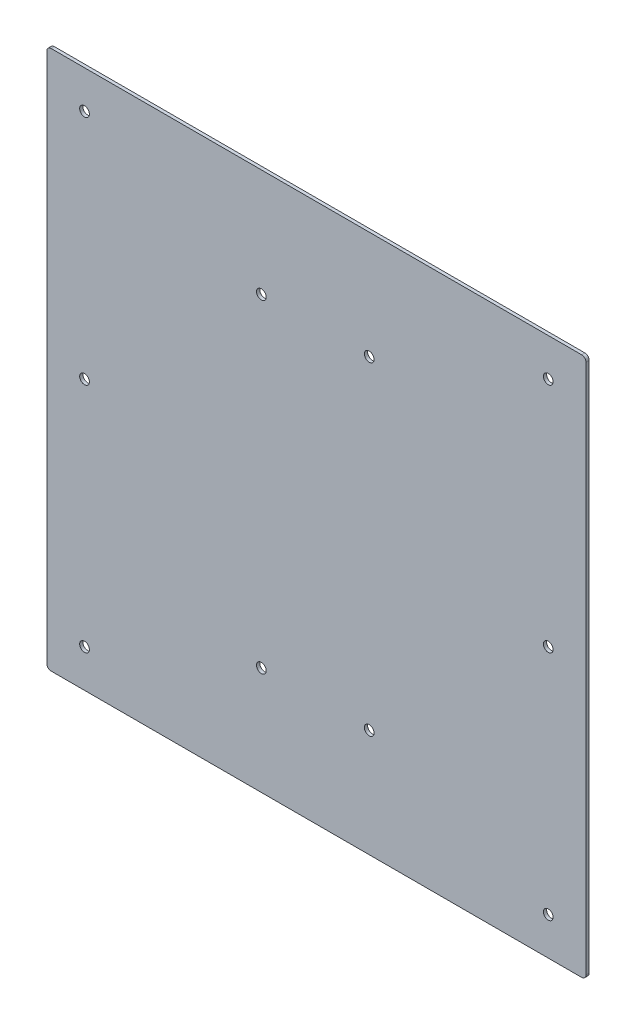
ISO-10303-21;
HEADER;
FILE_DESCRIPTION(('STEP AP214'),'2;1');
FILE_NAME('part.step','',(''),(''),'','','');
FILE_SCHEMA(('AUTOMOTIVE_DESIGN { 1 0 10303 214 1 1 1 1 }'));
ENDSEC;
DATA;
#1=APPLICATION_CONTEXT('core data for automotive mechanical design processes');
#2=APPLICATION_PROTOCOL_DEFINITION('international standard','automotive_design',2000,#1);
#3=PRODUCT_CONTEXT('',#1,'mechanical');
#4=PRODUCT('Part','Part','',(#3));
#5=PRODUCT_RELATED_PRODUCT_CATEGORY('part','',(#4));
#6=PRODUCT_DEFINITION_FORMATION('','',#4);
#7=PRODUCT_DEFINITION_CONTEXT('part definition',#1,'design');
#8=PRODUCT_DEFINITION('design','',#6,#7);
#9=PRODUCT_DEFINITION_SHAPE('','',#8);
#10=(LENGTH_UNIT() NAMED_UNIT(*) SI_UNIT(.MILLI.,.METRE.));
#11=(NAMED_UNIT(*) PLANE_ANGLE_UNIT() SI_UNIT($,.RADIAN.));
#12=(NAMED_UNIT(*) SI_UNIT($,.STERADIAN.) SOLID_ANGLE_UNIT());
#13=UNCERTAINTY_MEASURE_WITH_UNIT(LENGTH_MEASURE(1.E-05),#10,'distance_accuracy_value','');
#14=(GEOMETRIC_REPRESENTATION_CONTEXT(3) GLOBAL_UNCERTAINTY_ASSIGNED_CONTEXT((#13)) GLOBAL_UNIT_ASSIGNED_CONTEXT((#10,
#11,#12)) REPRESENTATION_CONTEXT('',''));
#15=CARTESIAN_POINT('',(0.,0.,0.));
#16=DIRECTION('',(0.,0.,1.));
#17=DIRECTION('',(1.,0.,0.));
#18=AXIS2_PLACEMENT_3D('',#15,#16,#17);
#19=CARTESIAN_POINT('',(0.,0.,1.4986));
#20=DIRECTION('',(0.,0.,-1.));
#21=DIRECTION('',(-1.,0.,0.));
#22=AXIS2_PLACEMENT_3D('',#19,#20,#21);
#23=PLANE('',#22);
#24=CARTESIAN_POINT('',(107.5,0.,1.4986));
#25=DIRECTION('',(0.,0.,1.));
#26=DIRECTION('',(1.,0.,0.));
#27=AXIS2_PLACEMENT_3D('',#24,#25,#26);
#28=CIRCLE('',#27,2.25);
#29=CARTESIAN_POINT('',(109.75,0.,1.4986));
#30=VERTEX_POINT('',#29);
#31=EDGE_CURVE('E218',#30,#30,#28,.T.);
#32=ORIENTED_EDGE('',*,*,#31,.F.);
#33=EDGE_LOOP('',(#32));
#34=FACE_BOUND('',#33,.T.);
#35=CARTESIAN_POINT('',(-107.5,-107.5,1.4986));
#36=DIRECTION('',(0.,0.,1.));
#37=DIRECTION('',(1.,0.,0.));
#38=AXIS2_PLACEMENT_3D('',#35,#36,#37);
#39=CIRCLE('',#38,2.25);
#40=CARTESIAN_POINT('',(-105.25,-107.5,1.4986));
#41=VERTEX_POINT('',#40);
#42=EDGE_CURVE('E213',#41,#41,#39,.T.);
#43=ORIENTED_EDGE('',*,*,#42,.F.);
#44=EDGE_LOOP('',(#43));
#45=FACE_BOUND('',#44,.T.);
#46=CARTESIAN_POINT('',(107.5,-107.5,1.4986));
#47=DIRECTION('',(0.,0.,1.));
#48=DIRECTION('',(1.,0.,0.));
#49=AXIS2_PLACEMENT_3D('',#46,#47,#48);
#50=CIRCLE('',#49,2.25);
#51=CARTESIAN_POINT('',(109.75,-107.5,1.4986));
#52=VERTEX_POINT('',#51);
#53=EDGE_CURVE('E206',#52,#52,#50,.T.);
#54=ORIENTED_EDGE('',*,*,#53,.F.);
#55=EDGE_LOOP('',(#54));
#56=FACE_BOUND('',#55,.T.);
#57=CARTESIAN_POINT('',(107.5,107.5,1.4986));
#58=DIRECTION('',(0.,0.,1.));
#59=DIRECTION('',(1.,0.,0.));
#60=AXIS2_PLACEMENT_3D('',#57,#58,#59);
#61=CIRCLE('',#60,2.25);
#62=CARTESIAN_POINT('',(109.75,107.5,1.4986));
#63=VERTEX_POINT('',#62);
#64=EDGE_CURVE('E205',#63,#63,#61,.T.);
#65=ORIENTED_EDGE('',*,*,#64,.F.);
#66=EDGE_LOOP('',(#65));
#67=FACE_BOUND('',#66,.T.);
#68=CARTESIAN_POINT('',(-107.5,0.,1.4986));
#69=DIRECTION('',(0.,0.,1.));
#70=DIRECTION('',(1.,0.,0.));
#71=AXIS2_PLACEMENT_3D('',#68,#69,#70);
#72=CIRCLE('',#71,2.25);
#73=CARTESIAN_POINT('',(-105.25,0.,1.4986));
#74=VERTEX_POINT('',#73);
#75=EDGE_CURVE('E225',#74,#74,#72,.T.);
#76=ORIENTED_EDGE('',*,*,#75,.F.);
#77=EDGE_LOOP('',(#76));
#78=FACE_BOUND('',#77,.T.);
#79=CARTESIAN_POINT('',(-107.5,107.5,1.4986));
#80=DIRECTION('',(0.,0.,1.));
#81=DIRECTION('',(1.,0.,0.));
#82=AXIS2_PLACEMENT_3D('',#79,#80,#81);
#83=CIRCLE('',#82,2.25);
#84=CARTESIAN_POINT('',(-105.25,107.5,1.4986));
#85=VERTEX_POINT('',#84);
#86=EDGE_CURVE('E202',#85,#85,#83,.T.);
#87=ORIENTED_EDGE('',*,*,#86,.F.);
#88=EDGE_LOOP('',(#87));
#89=FACE_BOUND('',#88,.T.);
#90=DIRECTION('',(0.,-1.,0.));
#91=VECTOR('',#90,1.);
#92=CARTESIAN_POINT('',(-125.,-125.,1.4986));
#93=LINE('',#92,#91);
#94=CARTESIAN_POINT('',(-125.,123.,1.4986));
#95=VERTEX_POINT('',#94);
#96=CARTESIAN_POINT('',(-125.,-123.,1.4986));
#97=VERTEX_POINT('',#96);
#98=EDGE_CURVE('E175',#95,#97,#93,.T.);
#99=ORIENTED_EDGE('',*,*,#98,.T.);
#100=CARTESIAN_POINT('',(-123.,-123.,1.4986));
#101=DIRECTION('',(0.,0.,-1.));
#102=DIRECTION('',(-1.,0.,0.));
#103=AXIS2_PLACEMENT_3D('',#100,#101,#102);
#104=CIRCLE('',#103,2.);
#105=CARTESIAN_POINT('',(-123.,-125.,1.4986));
#106=VERTEX_POINT('',#105);
#107=EDGE_CURVE('E152',#97,#106,#104,.F.);
#108=ORIENTED_EDGE('',*,*,#107,.T.);
#109=DIRECTION('',(1.,0.,0.));
#110=VECTOR('',#109,1.);
#111=CARTESIAN_POINT('',(-125.,-125.,1.4986));
#112=LINE('',#111,#110);
#113=CARTESIAN_POINT('',(123.,-125.,1.4986));
#114=VERTEX_POINT('',#113);
#115=EDGE_CURVE('E123',#106,#114,#112,.T.);
#116=ORIENTED_EDGE('',*,*,#115,.T.);
#117=CARTESIAN_POINT('',(123.,-123.,1.4986));
#118=DIRECTION('',(0.,0.,-1.));
#119=DIRECTION('',(-1.,0.,0.));
#120=AXIS2_PLACEMENT_3D('',#117,#118,#119);
#121=CIRCLE('',#120,2.);
#122=CARTESIAN_POINT('',(125.,-123.,1.4986));
#123=VERTEX_POINT('',#122);
#124=EDGE_CURVE('E150',#114,#123,#121,.F.);
#125=ORIENTED_EDGE('',*,*,#124,.T.);
#126=DIRECTION('',(0.,1.,0.));
#127=VECTOR('',#126,1.);
#128=CARTESIAN_POINT('',(125.,-125.,1.4986));
#129=LINE('',#128,#127);
#130=CARTESIAN_POINT('',(125.,123.,1.4986));
#131=VERTEX_POINT('',#130);
#132=EDGE_CURVE('E130',#123,#131,#129,.T.);
#133=ORIENTED_EDGE('',*,*,#132,.T.);
#134=CARTESIAN_POINT('',(123.,123.,1.4986));
#135=DIRECTION('',(0.,0.,-1.));
#136=DIRECTION('',(-1.,0.,0.));
#137=AXIS2_PLACEMENT_3D('',#134,#135,#136);
#138=CIRCLE('',#137,2.);
#139=CARTESIAN_POINT('',(123.,125.,1.4986));
#140=VERTEX_POINT('',#139);
#141=EDGE_CURVE('E58',#131,#140,#138,.F.);
#142=ORIENTED_EDGE('',*,*,#141,.T.);
#143=DIRECTION('',(-1.,0.,0.));
#144=VECTOR('',#143,1.);
#145=CARTESIAN_POINT('',(-125.,125.,1.4986));
#146=LINE('',#145,#144);
#147=CARTESIAN_POINT('',(-123.,125.,1.4986));
#148=VERTEX_POINT('',#147);
#149=EDGE_CURVE('E133',#140,#148,#146,.T.);
#150=ORIENTED_EDGE('',*,*,#149,.T.);
#151=CARTESIAN_POINT('',(-123.,123.,1.4986));
#152=DIRECTION('',(0.,0.,-1.));
#153=DIRECTION('',(-1.,0.,0.));
#154=AXIS2_PLACEMENT_3D('',#151,#152,#153);
#155=CIRCLE('',#154,2.);
#156=EDGE_CURVE('E147',#148,#95,#155,.F.);
#157=ORIENTED_EDGE('',*,*,#156,.T.);
#158=EDGE_LOOP('',(#99,#108,#116,#125,#133,#142,#150,#157));
#159=FACE_BOUND('',#158,.T.);
#160=CARTESIAN_POINT('',(-25.5,75.,1.4986));
#161=DIRECTION('',(0.,0.,1.));
#162=DIRECTION('',(1.,0.,0.));
#163=AXIS2_PLACEMENT_3D('',#160,#161,#162);
#164=CIRCLE('',#163,2.25);
#165=CARTESIAN_POINT('',(-27.75,75.,1.4986));
#166=VERTEX_POINT('',#165);
#167=EDGE_CURVE('E168',#166,#166,#164,.T.);
#168=ORIENTED_EDGE('',*,*,#167,.F.);
#169=EDGE_LOOP('',(#168));
#170=FACE_BOUND('',#169,.T.);
#171=CARTESIAN_POINT('',(24.5,75.,1.4986));
#172=DIRECTION('',(0.,0.,1.));
#173=DIRECTION('',(1.,0.,0.));
#174=AXIS2_PLACEMENT_3D('',#171,#172,#173);
#175=CIRCLE('',#174,2.25);
#176=CARTESIAN_POINT('',(22.25,75.,1.4986));
#177=VERTEX_POINT('',#176);
#178=EDGE_CURVE('E180',#177,#177,#175,.T.);
#179=ORIENTED_EDGE('',*,*,#178,.F.);
#180=EDGE_LOOP('',(#179));
#181=FACE_BOUND('',#180,.T.);
#182=CARTESIAN_POINT('',(24.5,-75.,1.4986));
#183=DIRECTION('',(0.,0.,1.));
#184=DIRECTION('',(1.,0.,0.));
#185=AXIS2_PLACEMENT_3D('',#182,#183,#184);
#186=CIRCLE('',#185,2.25);
#187=CARTESIAN_POINT('',(22.25,-75.,1.4986));
#188=VERTEX_POINT('',#187);
#189=EDGE_CURVE('E185',#188,#188,#186,.T.);
#190=ORIENTED_EDGE('',*,*,#189,.F.);
#191=EDGE_LOOP('',(#190));
#192=FACE_BOUND('',#191,.T.);
#193=CARTESIAN_POINT('',(-25.5,-75.,1.4986));
#194=DIRECTION('',(0.,0.,1.));
#195=DIRECTION('',(1.,0.,0.));
#196=AXIS2_PLACEMENT_3D('',#193,#194,#195);
#197=CIRCLE('',#196,2.25);
#198=CARTESIAN_POINT('',(-27.75,-75.,1.4986));
#199=VERTEX_POINT('',#198);
#200=EDGE_CURVE('E191',#199,#199,#197,.T.);
#201=ORIENTED_EDGE('',*,*,#200,.F.);
#202=EDGE_LOOP('',(#201));
#203=FACE_BOUND('',#202,.T.);
#204=ADVANCED_FACE('F37',(#34,#45,#56,#67,#78,#89,#159,#170,#181,#192,#203),#23,.F.);
#205=CARTESIAN_POINT('',(0.,0.,0.));
#206=DIRECTION('',(0.,0.,-1.));
#207=DIRECTION('',(-1.,0.,0.));
#208=AXIS2_PLACEMENT_3D('',#205,#206,#207);
#209=PLANE('',#208);
#210=CARTESIAN_POINT('',(107.5,0.,0.));
#211=DIRECTION('',(0.,0.,-1.));
#212=DIRECTION('',(-1.,0.,0.));
#213=AXIS2_PLACEMENT_3D('',#210,#211,#212);
#214=CIRCLE('',#213,2.25);
#215=CARTESIAN_POINT('',(105.25,0.,0.));
#216=VERTEX_POINT('',#215);
#217=EDGE_CURVE('E222',#216,#216,#214,.F.);
#218=ORIENTED_EDGE('',*,*,#217,.T.);
#219=EDGE_LOOP('',(#218));
#220=FACE_BOUND('',#219,.T.);
#221=CARTESIAN_POINT('',(-107.5,-107.5,0.));
#222=DIRECTION('',(0.,0.,-1.));
#223=DIRECTION('',(-1.,0.,0.));
#224=AXIS2_PLACEMENT_3D('',#221,#222,#223);
#225=CIRCLE('',#224,2.25);
#226=CARTESIAN_POINT('',(-109.75,-107.5,0.));
#227=VERTEX_POINT('',#226);
#228=EDGE_CURVE('E221',#227,#227,#225,.F.);
#229=ORIENTED_EDGE('',*,*,#228,.T.);
#230=EDGE_LOOP('',(#229));
#231=FACE_BOUND('',#230,.T.);
#232=CARTESIAN_POINT('',(107.5,-107.5,0.));
#233=DIRECTION('',(0.,0.,-1.));
#234=DIRECTION('',(-1.,0.,0.));
#235=AXIS2_PLACEMENT_3D('',#232,#233,#234);
#236=CIRCLE('',#235,2.25);
#237=CARTESIAN_POINT('',(105.25,-107.5,0.));
#238=VERTEX_POINT('',#237);
#239=EDGE_CURVE('E210',#238,#238,#236,.F.);
#240=ORIENTED_EDGE('',*,*,#239,.T.);
#241=EDGE_LOOP('',(#240));
#242=FACE_BOUND('',#241,.T.);
#243=CARTESIAN_POINT('',(107.5,107.5,0.));
#244=DIRECTION('',(0.,0.,-1.));
#245=DIRECTION('',(-1.,0.,0.));
#246=AXIS2_PLACEMENT_3D('',#243,#244,#245);
#247=CIRCLE('',#246,2.25);
#248=CARTESIAN_POINT('',(105.25,107.5,0.));
#249=VERTEX_POINT('',#248);
#250=EDGE_CURVE('E209',#249,#249,#247,.F.);
#251=ORIENTED_EDGE('',*,*,#250,.T.);
#252=EDGE_LOOP('',(#251));
#253=FACE_BOUND('',#252,.T.);
#254=CARTESIAN_POINT('',(-107.5,0.,0.));
#255=DIRECTION('',(0.,0.,-1.));
#256=DIRECTION('',(-1.,0.,0.));
#257=AXIS2_PLACEMENT_3D('',#254,#255,#256);
#258=CIRCLE('',#257,2.25);
#259=CARTESIAN_POINT('',(-109.75,0.,0.));
#260=VERTEX_POINT('',#259);
#261=EDGE_CURVE('E232',#260,#260,#258,.F.);
#262=ORIENTED_EDGE('',*,*,#261,.T.);
#263=EDGE_LOOP('',(#262));
#264=FACE_BOUND('',#263,.T.);
#265=CARTESIAN_POINT('',(-107.5,107.5,0.));
#266=DIRECTION('',(0.,0.,-1.));
#267=DIRECTION('',(-1.,0.,0.));
#268=AXIS2_PLACEMENT_3D('',#265,#266,#267);
#269=CIRCLE('',#268,2.25);
#270=CARTESIAN_POINT('',(-109.75,107.5,0.));
#271=VERTEX_POINT('',#270);
#272=EDGE_CURVE('E197',#271,#271,#269,.F.);
#273=ORIENTED_EDGE('',*,*,#272,.T.);
#274=EDGE_LOOP('',(#273));
#275=FACE_BOUND('',#274,.T.);
#276=CARTESIAN_POINT('',(24.5,-75.,0.));
#277=DIRECTION('',(0.,0.,1.));
#278=DIRECTION('',(1.,0.,0.));
#279=AXIS2_PLACEMENT_3D('',#276,#277,#278);
#280=CIRCLE('',#279,2.25);
#281=CARTESIAN_POINT('',(22.25,-75.,0.));
#282=VERTEX_POINT('',#281);
#283=EDGE_CURVE('E188',#282,#282,#280,.T.);
#284=ORIENTED_EDGE('',*,*,#283,.T.);
#285=EDGE_LOOP('',(#284));
#286=FACE_BOUND('',#285,.T.);
#287=CARTESIAN_POINT('',(-25.5,75.,0.));
#288=DIRECTION('',(0.,0.,1.));
#289=DIRECTION('',(1.,0.,0.));
#290=AXIS2_PLACEMENT_3D('',#287,#288,#289);
#291=CIRCLE('',#290,2.25);
#292=CARTESIAN_POINT('',(-27.75,75.,0.));
#293=VERTEX_POINT('',#292);
#294=EDGE_CURVE('E171',#293,#293,#291,.T.);
#295=ORIENTED_EDGE('',*,*,#294,.T.);
#296=EDGE_LOOP('',(#295));
#297=FACE_BOUND('',#296,.T.);
#298=DIRECTION('',(1.,0.,0.));
#299=VECTOR('',#298,1.);
#300=CARTESIAN_POINT('',(-125.,-125.,0.));
#301=LINE('',#300,#299);
#302=CARTESIAN_POINT('',(-123.,-125.,0.));
#303=VERTEX_POINT('',#302);
#304=CARTESIAN_POINT('',(123.,-125.,0.));
#305=VERTEX_POINT('',#304);
#306=EDGE_CURVE('E120',#303,#305,#301,.T.);
#307=ORIENTED_EDGE('',*,*,#306,.F.);
#308=CARTESIAN_POINT('',(-123.,-123.,0.));
#309=DIRECTION('',(0.,0.,-1.));
#310=DIRECTION('',(-1.,0.,0.));
#311=AXIS2_PLACEMENT_3D('',#308,#309,#310);
#312=CIRCLE('',#311,2.);
#313=CARTESIAN_POINT('',(-125.,-123.,0.));
#314=VERTEX_POINT('',#313);
#315=EDGE_CURVE('E103',#303,#314,#312,.T.);
#316=ORIENTED_EDGE('',*,*,#315,.T.);
#317=DIRECTION('',(0.,-1.,0.));
#318=VECTOR('',#317,1.);
#319=CARTESIAN_POINT('',(-125.,-125.,0.));
#320=LINE('',#319,#318);
#321=CARTESIAN_POINT('',(-125.,123.,0.));
#322=VERTEX_POINT('',#321);
#323=EDGE_CURVE('E131',#322,#314,#320,.T.);
#324=ORIENTED_EDGE('',*,*,#323,.F.);
#325=CARTESIAN_POINT('',(-123.,123.,0.));
#326=DIRECTION('',(0.,0.,-1.));
#327=DIRECTION('',(-1.,0.,0.));
#328=AXIS2_PLACEMENT_3D('',#325,#326,#327);
#329=CIRCLE('',#328,2.);
#330=CARTESIAN_POINT('',(-123.,125.,0.));
#331=VERTEX_POINT('',#330);
#332=EDGE_CURVE('E124',#322,#331,#329,.T.);
#333=ORIENTED_EDGE('',*,*,#332,.T.);
#334=DIRECTION('',(-1.,0.,0.));
#335=VECTOR('',#334,1.);
#336=CARTESIAN_POINT('',(-125.,125.,0.));
#337=LINE('',#336,#335);
#338=CARTESIAN_POINT('',(123.,125.,0.));
#339=VERTEX_POINT('',#338);
#340=EDGE_CURVE('E135',#339,#331,#337,.T.);
#341=ORIENTED_EDGE('',*,*,#340,.F.);
#342=CARTESIAN_POINT('',(123.,123.,0.));
#343=DIRECTION('',(0.,0.,-1.));
#344=DIRECTION('',(-1.,0.,0.));
#345=AXIS2_PLACEMENT_3D('',#342,#343,#344);
#346=CIRCLE('',#345,2.);
#347=CARTESIAN_POINT('',(125.,123.,0.));
#348=VERTEX_POINT('',#347);
#349=EDGE_CURVE('E141',#339,#348,#346,.T.);
#350=ORIENTED_EDGE('',*,*,#349,.T.);
#351=DIRECTION('',(0.,1.,0.));
#352=VECTOR('',#351,1.);
#353=CARTESIAN_POINT('',(125.,-125.,0.));
#354=LINE('',#353,#352);
#355=CARTESIAN_POINT('',(125.,-123.,0.));
#356=VERTEX_POINT('',#355);
#357=EDGE_CURVE('E163',#356,#348,#354,.T.);
#358=ORIENTED_EDGE('',*,*,#357,.F.);
#359=CARTESIAN_POINT('',(123.,-123.,0.));
#360=DIRECTION('',(0.,0.,-1.));
#361=DIRECTION('',(-1.,0.,0.));
#362=AXIS2_PLACEMENT_3D('',#359,#360,#361);
#363=CIRCLE('',#362,2.);
#364=EDGE_CURVE('E114',#356,#305,#363,.T.);
#365=ORIENTED_EDGE('',*,*,#364,.T.);
#366=EDGE_LOOP('',(#307,#316,#324,#333,#341,#350,#358,#365));
#367=FACE_BOUND('',#366,.T.);
#368=CARTESIAN_POINT('',(24.5,75.,0.));
#369=DIRECTION('',(0.,0.,1.));
#370=DIRECTION('',(1.,0.,0.));
#371=AXIS2_PLACEMENT_3D('',#368,#369,#370);
#372=CIRCLE('',#371,2.25);
#373=CARTESIAN_POINT('',(22.25,75.,0.));
#374=VERTEX_POINT('',#373);
#375=EDGE_CURVE('E182',#374,#374,#372,.T.);
#376=ORIENTED_EDGE('',*,*,#375,.T.);
#377=EDGE_LOOP('',(#376));
#378=FACE_BOUND('',#377,.T.);
#379=CARTESIAN_POINT('',(-25.5,-75.,0.));
#380=DIRECTION('',(0.,0.,1.));
#381=DIRECTION('',(1.,0.,0.));
#382=AXIS2_PLACEMENT_3D('',#379,#380,#381);
#383=CIRCLE('',#382,2.25);
#384=CARTESIAN_POINT('',(-27.75,-75.,0.));
#385=VERTEX_POINT('',#384);
#386=EDGE_CURVE('E194',#385,#385,#383,.T.);
#387=ORIENTED_EDGE('',*,*,#386,.T.);
#388=EDGE_LOOP('',(#387));
#389=FACE_BOUND('',#388,.T.);
#390=ADVANCED_FACE('F127',(#220,#231,#242,#253,#264,#275,#286,#297,#367,#378,#389),#209,.T.);
#391=CARTESIAN_POINT('',(125.,-125.,1.4986));
#392=DIRECTION('',(-1.,0.,0.));
#393=DIRECTION('',(0.,0.,1.));
#394=AXIS2_PLACEMENT_3D('',#391,#392,#393);
#395=PLANE('',#394);
#396=ORIENTED_EDGE('',*,*,#132,.F.);
#397=DIRECTION('',(0.,0.,-1.));
#398=VECTOR('',#397,1.);
#399=CARTESIAN_POINT('',(125.,-123.,1.4986));
#400=LINE('',#399,#398);
#401=EDGE_CURVE('E156',#123,#356,#400,.T.);
#402=ORIENTED_EDGE('',*,*,#401,.T.);
#403=ORIENTED_EDGE('',*,*,#357,.T.);
#404=DIRECTION('',(0.,0.,-1.));
#405=VECTOR('',#404,1.);
#406=CARTESIAN_POINT('',(125.,123.,1.4986));
#407=LINE('',#406,#405);
#408=EDGE_CURVE('E154',#348,#131,#407,.F.);
#409=ORIENTED_EDGE('',*,*,#408,.T.);
#410=EDGE_LOOP('',(#396,#402,#403,#409));
#411=FACE_BOUND('',#410,.T.);
#412=ADVANCED_FACE('F162',(#411),#395,.F.);
#413=CARTESIAN_POINT('',(-125.,125.,1.4986));
#414=DIRECTION('',(0.,-1.,0.));
#415=DIRECTION('',(0.,0.,-1.));
#416=AXIS2_PLACEMENT_3D('',#413,#414,#415);
#417=PLANE('',#416);
#418=ORIENTED_EDGE('',*,*,#149,.F.);
#419=DIRECTION('',(0.,0.,-1.));
#420=VECTOR('',#419,1.);
#421=CARTESIAN_POINT('',(123.,125.,1.4986));
#422=LINE('',#421,#420);
#423=EDGE_CURVE('E11',#140,#339,#422,.T.);
#424=ORIENTED_EDGE('',*,*,#423,.T.);
#425=ORIENTED_EDGE('',*,*,#340,.T.);
#426=DIRECTION('',(0.,0.,-1.));
#427=VECTOR('',#426,1.);
#428=CARTESIAN_POINT('',(-123.,125.,1.4986));
#429=LINE('',#428,#427);
#430=EDGE_CURVE('E45',#331,#148,#429,.F.);
#431=ORIENTED_EDGE('',*,*,#430,.T.);
#432=EDGE_LOOP('',(#418,#424,#425,#431));
#433=FACE_BOUND('',#432,.T.);
#434=ADVANCED_FACE('F273',(#433),#417,.F.);
#435=CARTESIAN_POINT('',(-125.,-125.,1.4986));
#436=DIRECTION('',(1.,0.,0.));
#437=DIRECTION('',(0.,0.,-1.));
#438=AXIS2_PLACEMENT_3D('',#435,#436,#437);
#439=PLANE('',#438);
#440=ORIENTED_EDGE('',*,*,#323,.T.);
#441=DIRECTION('',(0.,0.,-1.));
#442=VECTOR('',#441,1.);
#443=CARTESIAN_POINT('',(-125.,-123.,1.4986));
#444=LINE('',#443,#442);
#445=EDGE_CURVE('E108',#314,#97,#444,.F.);
#446=ORIENTED_EDGE('',*,*,#445,.T.);
#447=ORIENTED_EDGE('',*,*,#98,.F.);
#448=DIRECTION('',(0.,0.,-1.));
#449=VECTOR('',#448,1.);
#450=CARTESIAN_POINT('',(-125.,123.,1.4986));
#451=LINE('',#450,#449);
#452=EDGE_CURVE('E113',#95,#322,#451,.T.);
#453=ORIENTED_EDGE('',*,*,#452,.T.);
#454=EDGE_LOOP('',(#440,#446,#447,#453));
#455=FACE_BOUND('',#454,.T.);
#456=ADVANCED_FACE('F270',(#455),#439,.F.);
#457=CARTESIAN_POINT('',(-125.,-125.,1.4986));
#458=DIRECTION('',(0.,1.,0.));
#459=DIRECTION('',(0.,0.,1.));
#460=AXIS2_PLACEMENT_3D('',#457,#458,#459);
#461=PLANE('',#460);
#462=ORIENTED_EDGE('',*,*,#115,.F.);
#463=DIRECTION('',(0.,0.,-1.));
#464=VECTOR('',#463,1.);
#465=CARTESIAN_POINT('',(-123.,-125.,1.4986));
#466=LINE('',#465,#464);
#467=EDGE_CURVE('E107',#106,#303,#466,.T.);
#468=ORIENTED_EDGE('',*,*,#467,.T.);
#469=ORIENTED_EDGE('',*,*,#306,.T.);
#470=DIRECTION('',(0.,0.,-1.));
#471=VECTOR('',#470,1.);
#472=CARTESIAN_POINT('',(123.,-125.,1.4986));
#473=LINE('',#472,#471);
#474=EDGE_CURVE('E125',#305,#114,#473,.F.);
#475=ORIENTED_EDGE('',*,*,#474,.T.);
#476=EDGE_LOOP('',(#462,#468,#469,#475));
#477=FACE_BOUND('',#476,.T.);
#478=ADVANCED_FACE('F119',(#477),#461,.F.);
#479=CARTESIAN_POINT('',(-25.5,75.,1.4986));
#480=DIRECTION('',(0.,0.,-1.));
#481=DIRECTION('',(-1.,0.,0.));
#482=AXIS2_PLACEMENT_3D('',#479,#480,#481);
#483=CYLINDRICAL_SURFACE('',#482,2.25);
#484=CARTESIAN_POINT('',(-27.75,75.,1.4986));
#485=CARTESIAN_POINT('',(-27.75,75.,1.48298958333333));
#486=CARTESIAN_POINT('',(-27.75,75.,1.46737916666667));
#487=CARTESIAN_POINT('',(-27.75,75.,1.43615833333333));
#488=CARTESIAN_POINT('',(-27.75,75.,1.42054791666667));
#489=CARTESIAN_POINT('',(-27.75,75.,1.38932708333333));
#490=CARTESIAN_POINT('',(-27.75,75.,1.37371666666667));
#491=CARTESIAN_POINT('',(-27.75,75.,1.34249583333333));
#492=CARTESIAN_POINT('',(-27.75,75.,1.32688541666667));
#493=CARTESIAN_POINT('',(-27.75,75.,1.29566458333333));
#494=CARTESIAN_POINT('',(-27.75,75.,1.28005416666667));
#495=CARTESIAN_POINT('',(-27.75,75.,1.24883333333333));
#496=CARTESIAN_POINT('',(-27.75,75.,1.23322291666667));
#497=CARTESIAN_POINT('',(-27.75,75.,1.20200208333333));
#498=CARTESIAN_POINT('',(-27.75,75.,1.18639166666667));
#499=CARTESIAN_POINT('',(-27.75,75.,1.15517083333333));
#500=CARTESIAN_POINT('',(-27.75,75.,1.13956041666667));
#501=CARTESIAN_POINT('',(-27.75,75.,1.10833958333333));
#502=CARTESIAN_POINT('',(-27.75,75.,1.09272916666667));
#503=CARTESIAN_POINT('',(-27.75,75.,1.06150833333333));
#504=CARTESIAN_POINT('',(-27.75,75.,1.04589791666667));
#505=CARTESIAN_POINT('',(-27.75,75.,1.01467708333333));
#506=CARTESIAN_POINT('',(-27.75,75.,0.999066666666667));
#507=CARTESIAN_POINT('',(-27.75,75.,0.967845833333333));
#508=CARTESIAN_POINT('',(-27.75,75.,0.952235416666667));
#509=CARTESIAN_POINT('',(-27.75,75.,0.921014583333333));
#510=CARTESIAN_POINT('',(-27.75,75.,0.905404166666667));
#511=CARTESIAN_POINT('',(-27.75,75.,0.874183333333333));
#512=CARTESIAN_POINT('',(-27.75,75.,0.858572916666667));
#513=CARTESIAN_POINT('',(-27.75,75.,0.827352083333333));
#514=CARTESIAN_POINT('',(-27.75,75.,0.811741666666667));
#515=CARTESIAN_POINT('',(-27.75,75.,0.780520833333333));
#516=CARTESIAN_POINT('',(-27.75,75.,0.764910416666667));
#517=CARTESIAN_POINT('',(-27.75,75.,0.733689583333333));
#518=CARTESIAN_POINT('',(-27.75,75.,0.718079166666667));
#519=CARTESIAN_POINT('',(-27.75,75.,0.686858333333333));
#520=CARTESIAN_POINT('',(-27.75,75.,0.671247916666667));
#521=CARTESIAN_POINT('',(-27.75,75.,0.640027083333333));
#522=CARTESIAN_POINT('',(-27.75,75.,0.624416666666667));
#523=CARTESIAN_POINT('',(-27.75,75.,0.593195833333333));
#524=CARTESIAN_POINT('',(-27.75,75.,0.577585416666667));
#525=CARTESIAN_POINT('',(-27.75,75.,0.546364583333333));
#526=CARTESIAN_POINT('',(-27.75,75.,0.530754166666667));
#527=CARTESIAN_POINT('',(-27.75,75.,0.499533333333333));
#528=CARTESIAN_POINT('',(-27.75,75.,0.483922916666667));
#529=CARTESIAN_POINT('',(-27.75,75.,0.452702083333333));
#530=CARTESIAN_POINT('',(-27.75,75.,0.437091666666667));
#531=CARTESIAN_POINT('',(-27.75,75.,0.405870833333333));
#532=CARTESIAN_POINT('',(-27.75,75.,0.390260416666667));
#533=CARTESIAN_POINT('',(-27.75,75.,0.359039583333333));
#534=CARTESIAN_POINT('',(-27.75,75.,0.343429166666667));
#535=CARTESIAN_POINT('',(-27.75,75.,0.312208333333333));
#536=CARTESIAN_POINT('',(-27.75,75.,0.296597916666667));
#537=CARTESIAN_POINT('',(-27.75,75.,0.265377083333333));
#538=CARTESIAN_POINT('',(-27.75,75.,0.249766666666667));
#539=CARTESIAN_POINT('',(-27.75,75.,0.218545833333333));
#540=CARTESIAN_POINT('',(-27.75,75.,0.202935416666667));
#541=CARTESIAN_POINT('',(-27.75,75.,0.171714583333333));
#542=CARTESIAN_POINT('',(-27.75,75.,0.156104166666667));
#543=CARTESIAN_POINT('',(-27.75,75.,0.124883333333333));
#544=CARTESIAN_POINT('',(-27.75,75.,0.109272916666667));
#545=CARTESIAN_POINT('',(-27.75,75.,0.0780520833333333));
#546=CARTESIAN_POINT('',(-27.75,75.,0.0624416666666667));
#547=CARTESIAN_POINT('',(-27.75,75.,0.0312208333333334));
#548=CARTESIAN_POINT('',(-27.75,75.,0.0156104166666667));
#549=CARTESIAN_POINT('',(-27.75,75.,0.));
#550=B_SPLINE_CURVE_WITH_KNOTS('',3,(#484,#485,#486,#487,#488,#489,#490,#491,#492,#493,#494,
#495,#496,#497,#498,#499,#500,#501,#502,#503,#504,#505,#506,#507,#508,#509,#510,#511,#512,#513,
#514,#515,#516,#517,#518,#519,#520,#521,#522,#523,#524,#525,#526,#527,#528,#529,#530,#531,#532,
#533,#534,#535,#536,#537,#538,#539,#540,#541,#542,#543,#544,#545,#546,#547,#548,#549),
.UNSPECIFIED.,.F.,.F.,(4,2,2,2,2,2,2,2,2,2,2,2,2,2,2,2,2,2,2,2,2,2,2,2,2,2,2,2,2,2,2,2,4),(0.,
0.0468312499999999,0.0936625,0.14049375,0.187325,0.23415625,0.2809875,0.32781875,0.37465,
0.42148125,0.4683125,0.51514375,0.561975,0.60880625,0.6556375,0.70246875,0.7493,0.79613125,
0.8429625,0.88979375,0.936625,0.98345625,1.0302875,1.07711875,1.12395,1.17078125,1.2176125,
1.26444375,1.311275,1.35810625,1.4049375,1.45176875,1.4986),.UNSPECIFIED.);
#551=EDGE_CURVE('BSEAM265',#166,#293,#550,.T.);
#552=ORIENTED_EDGE('',*,*,#167,.T.);
#553=ORIENTED_EDGE('',*,*,#294,.F.);
#554=ORIENTED_EDGE('',*,*,#551,.T.);
#555=ORIENTED_EDGE('',*,*,#551,.F.);
#556=EDGE_LOOP('',(#552,#554,#553,#555));
#557=FACE_BOUND('',#556,.T.);
#558=ADVANCED_FACE('F265',(#557),#483,.F.);
#559=CARTESIAN_POINT('',(24.5,75.,1.4986));
#560=DIRECTION('',(0.,0.,-1.));
#561=DIRECTION('',(-1.,0.,0.));
#562=AXIS2_PLACEMENT_3D('',#559,#560,#561);
#563=CYLINDRICAL_SURFACE('',#562,2.25);
#564=CARTESIAN_POINT('',(22.25,75.,1.4986));
#565=CARTESIAN_POINT('',(22.25,75.,1.48298958333333));
#566=CARTESIAN_POINT('',(22.25,75.,1.46737916666667));
#567=CARTESIAN_POINT('',(22.25,75.,1.43615833333333));
#568=CARTESIAN_POINT('',(22.25,75.,1.42054791666667));
#569=CARTESIAN_POINT('',(22.25,75.,1.38932708333333));
#570=CARTESIAN_POINT('',(22.25,75.,1.37371666666667));
#571=CARTESIAN_POINT('',(22.25,75.,1.34249583333333));
#572=CARTESIAN_POINT('',(22.25,75.,1.32688541666667));
#573=CARTESIAN_POINT('',(22.25,75.,1.29566458333333));
#574=CARTESIAN_POINT('',(22.25,75.,1.28005416666667));
#575=CARTESIAN_POINT('',(22.25,75.,1.24883333333333));
#576=CARTESIAN_POINT('',(22.25,75.,1.23322291666667));
#577=CARTESIAN_POINT('',(22.25,75.,1.20200208333333));
#578=CARTESIAN_POINT('',(22.25,75.,1.18639166666667));
#579=CARTESIAN_POINT('',(22.25,75.,1.15517083333333));
#580=CARTESIAN_POINT('',(22.25,75.,1.13956041666667));
#581=CARTESIAN_POINT('',(22.25,75.,1.10833958333333));
#582=CARTESIAN_POINT('',(22.25,75.,1.09272916666667));
#583=CARTESIAN_POINT('',(22.25,75.,1.06150833333333));
#584=CARTESIAN_POINT('',(22.25,75.,1.04589791666667));
#585=CARTESIAN_POINT('',(22.25,75.,1.01467708333333));
#586=CARTESIAN_POINT('',(22.25,75.,0.999066666666667));
#587=CARTESIAN_POINT('',(22.25,75.,0.967845833333333));
#588=CARTESIAN_POINT('',(22.25,75.,0.952235416666667));
#589=CARTESIAN_POINT('',(22.25,75.,0.921014583333333));
#590=CARTESIAN_POINT('',(22.25,75.,0.905404166666667));
#591=CARTESIAN_POINT('',(22.25,75.,0.874183333333333));
#592=CARTESIAN_POINT('',(22.25,75.,0.858572916666667));
#593=CARTESIAN_POINT('',(22.25,75.,0.827352083333333));
#594=CARTESIAN_POINT('',(22.25,75.,0.811741666666667));
#595=CARTESIAN_POINT('',(22.25,75.,0.780520833333333));
#596=CARTESIAN_POINT('',(22.25,75.,0.764910416666667));
#597=CARTESIAN_POINT('',(22.25,75.,0.733689583333333));
#598=CARTESIAN_POINT('',(22.25,75.,0.718079166666667));
#599=CARTESIAN_POINT('',(22.25,75.,0.686858333333333));
#600=CARTESIAN_POINT('',(22.25,75.,0.671247916666667));
#601=CARTESIAN_POINT('',(22.25,75.,0.640027083333333));
#602=CARTESIAN_POINT('',(22.25,75.,0.624416666666667));
#603=CARTESIAN_POINT('',(22.25,75.,0.593195833333333));
#604=CARTESIAN_POINT('',(22.25,75.,0.577585416666667));
#605=CARTESIAN_POINT('',(22.25,75.,0.546364583333333));
#606=CARTESIAN_POINT('',(22.25,75.,0.530754166666667));
#607=CARTESIAN_POINT('',(22.25,75.,0.499533333333333));
#608=CARTESIAN_POINT('',(22.25,75.,0.483922916666667));
#609=CARTESIAN_POINT('',(22.25,75.,0.452702083333333));
#610=CARTESIAN_POINT('',(22.25,75.,0.437091666666667));
#611=CARTESIAN_POINT('',(22.25,75.,0.405870833333333));
#612=CARTESIAN_POINT('',(22.25,75.,0.390260416666667));
#613=CARTESIAN_POINT('',(22.25,75.,0.359039583333333));
#614=CARTESIAN_POINT('',(22.25,75.,0.343429166666667));
#615=CARTESIAN_POINT('',(22.25,75.,0.312208333333333));
#616=CARTESIAN_POINT('',(22.25,75.,0.296597916666667));
#617=CARTESIAN_POINT('',(22.25,75.,0.265377083333333));
#618=CARTESIAN_POINT('',(22.25,75.,0.249766666666667));
#619=CARTESIAN_POINT('',(22.25,75.,0.218545833333333));
#620=CARTESIAN_POINT('',(22.25,75.,0.202935416666667));
#621=CARTESIAN_POINT('',(22.25,75.,0.171714583333333));
#622=CARTESIAN_POINT('',(22.25,75.,0.156104166666667));
#623=CARTESIAN_POINT('',(22.25,75.,0.124883333333333));
#624=CARTESIAN_POINT('',(22.25,75.,0.109272916666667));
#625=CARTESIAN_POINT('',(22.25,75.,0.0780520833333333));
#626=CARTESIAN_POINT('',(22.25,75.,0.0624416666666667));
#627=CARTESIAN_POINT('',(22.25,75.,0.0312208333333334));
#628=CARTESIAN_POINT('',(22.25,75.,0.0156104166666667));
#629=CARTESIAN_POINT('',(22.25,75.,0.));
#630=B_SPLINE_CURVE_WITH_KNOTS('',3,(#564,#565,#566,#567,#568,#569,#570,#571,#572,#573,#574,
#575,#576,#577,#578,#579,#580,#581,#582,#583,#584,#585,#586,#587,#588,#589,#590,#591,#592,#593,
#594,#595,#596,#597,#598,#599,#600,#601,#602,#603,#604,#605,#606,#607,#608,#609,#610,#611,#612,
#613,#614,#615,#616,#617,#618,#619,#620,#621,#622,#623,#624,#625,#626,#627,#628,#629),
.UNSPECIFIED.,.F.,.F.,(4,2,2,2,2,2,2,2,2,2,2,2,2,2,2,2,2,2,2,2,2,2,2,2,2,2,2,2,2,2,2,2,4),(0.,
0.0468312499999999,0.0936625,0.14049375,0.187325,0.23415625,0.2809875,0.32781875,0.37465,
0.42148125,0.4683125,0.51514375,0.561975,0.60880625,0.6556375,0.70246875,0.7493,0.79613125,
0.8429625,0.88979375,0.936625,0.98345625,1.0302875,1.07711875,1.12395,1.17078125,1.2176125,
1.26444375,1.311275,1.35810625,1.4049375,1.45176875,1.4986),.UNSPECIFIED.);
#631=EDGE_CURVE('BSEAM313',#177,#374,#630,.T.);
#632=ORIENTED_EDGE('',*,*,#178,.T.);
#633=ORIENTED_EDGE('',*,*,#375,.F.);
#634=ORIENTED_EDGE('',*,*,#631,.T.);
#635=ORIENTED_EDGE('',*,*,#631,.F.);
#636=EDGE_LOOP('',(#632,#634,#633,#635));
#637=FACE_BOUND('',#636,.T.);
#638=ADVANCED_FACE('F313',(#637),#563,.F.);
#639=CARTESIAN_POINT('',(24.5,-75.,1.4986));
#640=DIRECTION('',(0.,0.,-1.));
#641=DIRECTION('',(-1.,0.,0.));
#642=AXIS2_PLACEMENT_3D('',#639,#640,#641);
#643=CYLINDRICAL_SURFACE('',#642,2.25);
#644=CARTESIAN_POINT('',(22.25,-75.,1.4986));
#645=CARTESIAN_POINT('',(22.25,-75.,1.48298958333333));
#646=CARTESIAN_POINT('',(22.25,-75.,1.46737916666667));
#647=CARTESIAN_POINT('',(22.25,-75.,1.43615833333333));
#648=CARTESIAN_POINT('',(22.25,-75.,1.42054791666667));
#649=CARTESIAN_POINT('',(22.25,-75.,1.38932708333333));
#650=CARTESIAN_POINT('',(22.25,-75.,1.37371666666667));
#651=CARTESIAN_POINT('',(22.25,-75.,1.34249583333333));
#652=CARTESIAN_POINT('',(22.25,-75.,1.32688541666667));
#653=CARTESIAN_POINT('',(22.25,-75.,1.29566458333333));
#654=CARTESIAN_POINT('',(22.25,-75.,1.28005416666667));
#655=CARTESIAN_POINT('',(22.25,-75.,1.24883333333333));
#656=CARTESIAN_POINT('',(22.25,-75.,1.23322291666667));
#657=CARTESIAN_POINT('',(22.25,-75.,1.20200208333333));
#658=CARTESIAN_POINT('',(22.25,-75.,1.18639166666667));
#659=CARTESIAN_POINT('',(22.25,-75.,1.15517083333333));
#660=CARTESIAN_POINT('',(22.25,-75.,1.13956041666667));
#661=CARTESIAN_POINT('',(22.25,-75.,1.10833958333333));
#662=CARTESIAN_POINT('',(22.25,-75.,1.09272916666667));
#663=CARTESIAN_POINT('',(22.25,-75.,1.06150833333333));
#664=CARTESIAN_POINT('',(22.25,-75.,1.04589791666667));
#665=CARTESIAN_POINT('',(22.25,-75.,1.01467708333333));
#666=CARTESIAN_POINT('',(22.25,-75.,0.999066666666667));
#667=CARTESIAN_POINT('',(22.25,-75.,0.967845833333333));
#668=CARTESIAN_POINT('',(22.25,-75.,0.952235416666667));
#669=CARTESIAN_POINT('',(22.25,-75.,0.921014583333333));
#670=CARTESIAN_POINT('',(22.25,-75.,0.905404166666667));
#671=CARTESIAN_POINT('',(22.25,-75.,0.874183333333333));
#672=CARTESIAN_POINT('',(22.25,-75.,0.858572916666667));
#673=CARTESIAN_POINT('',(22.25,-75.,0.827352083333333));
#674=CARTESIAN_POINT('',(22.25,-75.,0.811741666666667));
#675=CARTESIAN_POINT('',(22.25,-75.,0.780520833333333));
#676=CARTESIAN_POINT('',(22.25,-75.,0.764910416666667));
#677=CARTESIAN_POINT('',(22.25,-75.,0.733689583333333));
#678=CARTESIAN_POINT('',(22.25,-75.,0.718079166666667));
#679=CARTESIAN_POINT('',(22.25,-75.,0.686858333333333));
#680=CARTESIAN_POINT('',(22.25,-75.,0.671247916666667));
#681=CARTESIAN_POINT('',(22.25,-75.,0.640027083333333));
#682=CARTESIAN_POINT('',(22.25,-75.,0.624416666666667));
#683=CARTESIAN_POINT('',(22.25,-75.,0.593195833333333));
#684=CARTESIAN_POINT('',(22.25,-75.,0.577585416666667));
#685=CARTESIAN_POINT('',(22.25,-75.,0.546364583333333));
#686=CARTESIAN_POINT('',(22.25,-75.,0.530754166666667));
#687=CARTESIAN_POINT('',(22.25,-75.,0.499533333333333));
#688=CARTESIAN_POINT('',(22.25,-75.,0.483922916666667));
#689=CARTESIAN_POINT('',(22.25,-75.,0.452702083333333));
#690=CARTESIAN_POINT('',(22.25,-75.,0.437091666666667));
#691=CARTESIAN_POINT('',(22.25,-75.,0.405870833333333));
#692=CARTESIAN_POINT('',(22.25,-75.,0.390260416666667));
#693=CARTESIAN_POINT('',(22.25,-75.,0.359039583333333));
#694=CARTESIAN_POINT('',(22.25,-75.,0.343429166666667));
#695=CARTESIAN_POINT('',(22.25,-75.,0.312208333333333));
#696=CARTESIAN_POINT('',(22.25,-75.,0.296597916666667));
#697=CARTESIAN_POINT('',(22.25,-75.,0.265377083333333));
#698=CARTESIAN_POINT('',(22.25,-75.,0.249766666666667));
#699=CARTESIAN_POINT('',(22.25,-75.,0.218545833333333));
#700=CARTESIAN_POINT('',(22.25,-75.,0.202935416666667));
#701=CARTESIAN_POINT('',(22.25,-75.,0.171714583333333));
#702=CARTESIAN_POINT('',(22.25,-75.,0.156104166666667));
#703=CARTESIAN_POINT('',(22.25,-75.,0.124883333333333));
#704=CARTESIAN_POINT('',(22.25,-75.,0.109272916666667));
#705=CARTESIAN_POINT('',(22.25,-75.,0.0780520833333333));
#706=CARTESIAN_POINT('',(22.25,-75.,0.0624416666666667));
#707=CARTESIAN_POINT('',(22.25,-75.,0.0312208333333334));
#708=CARTESIAN_POINT('',(22.25,-75.,0.0156104166666667));
#709=CARTESIAN_POINT('',(22.25,-75.,0.));
#710=B_SPLINE_CURVE_WITH_KNOTS('',3,(#644,#645,#646,#647,#648,#649,#650,#651,#652,#653,#654,
#655,#656,#657,#658,#659,#660,#661,#662,#663,#664,#665,#666,#667,#668,#669,#670,#671,#672,#673,
#674,#675,#676,#677,#678,#679,#680,#681,#682,#683,#684,#685,#686,#687,#688,#689,#690,#691,#692,
#693,#694,#695,#696,#697,#698,#699,#700,#701,#702,#703,#704,#705,#706,#707,#708,#709),
.UNSPECIFIED.,.F.,.F.,(4,2,2,2,2,2,2,2,2,2,2,2,2,2,2,2,2,2,2,2,2,2,2,2,2,2,2,2,2,2,2,2,4),(0.,
0.0468312499999999,0.0936625,0.14049375,0.187325,0.23415625,0.2809875,0.32781875,0.37465,
0.42148125,0.4683125,0.51514375,0.561975,0.60880625,0.6556375,0.70246875,0.7493,0.79613125,
0.8429625,0.88979375,0.936625,0.98345625,1.0302875,1.07711875,1.12395,1.17078125,1.2176125,
1.26444375,1.311275,1.35810625,1.4049375,1.45176875,1.4986),.UNSPECIFIED.);
#711=EDGE_CURVE('BSEAM306',#188,#282,#710,.T.);
#712=ORIENTED_EDGE('',*,*,#189,.T.);
#713=ORIENTED_EDGE('',*,*,#283,.F.);
#714=ORIENTED_EDGE('',*,*,#711,.T.);
#715=ORIENTED_EDGE('',*,*,#711,.F.);
#716=EDGE_LOOP('',(#712,#714,#713,#715));
#717=FACE_BOUND('',#716,.T.);
#718=ADVANCED_FACE('F306',(#717),#643,.F.);
#719=CARTESIAN_POINT('',(-25.5,-75.,1.4986));
#720=DIRECTION('',(0.,0.,-1.));
#721=DIRECTION('',(-1.,0.,0.));
#722=AXIS2_PLACEMENT_3D('',#719,#720,#721);
#723=CYLINDRICAL_SURFACE('',#722,2.25);
#724=CARTESIAN_POINT('',(-27.75,-75.,1.4986));
#725=CARTESIAN_POINT('',(-27.75,-75.,1.48298958333333));
#726=CARTESIAN_POINT('',(-27.75,-75.,1.46737916666667));
#727=CARTESIAN_POINT('',(-27.75,-75.,1.43615833333333));
#728=CARTESIAN_POINT('',(-27.75,-75.,1.42054791666667));
#729=CARTESIAN_POINT('',(-27.75,-75.,1.38932708333333));
#730=CARTESIAN_POINT('',(-27.75,-75.,1.37371666666667));
#731=CARTESIAN_POINT('',(-27.75,-75.,1.34249583333333));
#732=CARTESIAN_POINT('',(-27.75,-75.,1.32688541666667));
#733=CARTESIAN_POINT('',(-27.75,-75.,1.29566458333333));
#734=CARTESIAN_POINT('',(-27.75,-75.,1.28005416666667));
#735=CARTESIAN_POINT('',(-27.75,-75.,1.24883333333333));
#736=CARTESIAN_POINT('',(-27.75,-75.,1.23322291666667));
#737=CARTESIAN_POINT('',(-27.75,-75.,1.20200208333333));
#738=CARTESIAN_POINT('',(-27.75,-75.,1.18639166666667));
#739=CARTESIAN_POINT('',(-27.75,-75.,1.15517083333333));
#740=CARTESIAN_POINT('',(-27.75,-75.,1.13956041666667));
#741=CARTESIAN_POINT('',(-27.75,-75.,1.10833958333333));
#742=CARTESIAN_POINT('',(-27.75,-75.,1.09272916666667));
#743=CARTESIAN_POINT('',(-27.75,-75.,1.06150833333333));
#744=CARTESIAN_POINT('',(-27.75,-75.,1.04589791666667));
#745=CARTESIAN_POINT('',(-27.75,-75.,1.01467708333333));
#746=CARTESIAN_POINT('',(-27.75,-75.,0.999066666666667));
#747=CARTESIAN_POINT('',(-27.75,-75.,0.967845833333333));
#748=CARTESIAN_POINT('',(-27.75,-75.,0.952235416666667));
#749=CARTESIAN_POINT('',(-27.75,-75.,0.921014583333333));
#750=CARTESIAN_POINT('',(-27.75,-75.,0.905404166666667));
#751=CARTESIAN_POINT('',(-27.75,-75.,0.874183333333333));
#752=CARTESIAN_POINT('',(-27.75,-75.,0.858572916666667));
#753=CARTESIAN_POINT('',(-27.75,-75.,0.827352083333333));
#754=CARTESIAN_POINT('',(-27.75,-75.,0.811741666666667));
#755=CARTESIAN_POINT('',(-27.75,-75.,0.780520833333333));
#756=CARTESIAN_POINT('',(-27.75,-75.,0.764910416666667));
#757=CARTESIAN_POINT('',(-27.75,-75.,0.733689583333333));
#758=CARTESIAN_POINT('',(-27.75,-75.,0.718079166666667));
#759=CARTESIAN_POINT('',(-27.75,-75.,0.686858333333333));
#760=CARTESIAN_POINT('',(-27.75,-75.,0.671247916666667));
#761=CARTESIAN_POINT('',(-27.75,-75.,0.640027083333333));
#762=CARTESIAN_POINT('',(-27.75,-75.,0.624416666666667));
#763=CARTESIAN_POINT('',(-27.75,-75.,0.593195833333333));
#764=CARTESIAN_POINT('',(-27.75,-75.,0.577585416666667));
#765=CARTESIAN_POINT('',(-27.75,-75.,0.546364583333333));
#766=CARTESIAN_POINT('',(-27.75,-75.,0.530754166666667));
#767=CARTESIAN_POINT('',(-27.75,-75.,0.499533333333333));
#768=CARTESIAN_POINT('',(-27.75,-75.,0.483922916666667));
#769=CARTESIAN_POINT('',(-27.75,-75.,0.452702083333333));
#770=CARTESIAN_POINT('',(-27.75,-75.,0.437091666666667));
#771=CARTESIAN_POINT('',(-27.75,-75.,0.405870833333333));
#772=CARTESIAN_POINT('',(-27.75,-75.,0.390260416666667));
#773=CARTESIAN_POINT('',(-27.75,-75.,0.359039583333333));
#774=CARTESIAN_POINT('',(-27.75,-75.,0.343429166666667));
#775=CARTESIAN_POINT('',(-27.75,-75.,0.312208333333333));
#776=CARTESIAN_POINT('',(-27.75,-75.,0.296597916666667));
#777=CARTESIAN_POINT('',(-27.75,-75.,0.265377083333333));
#778=CARTESIAN_POINT('',(-27.75,-75.,0.249766666666667));
#779=CARTESIAN_POINT('',(-27.75,-75.,0.218545833333333));
#780=CARTESIAN_POINT('',(-27.75,-75.,0.202935416666667));
#781=CARTESIAN_POINT('',(-27.75,-75.,0.171714583333333));
#782=CARTESIAN_POINT('',(-27.75,-75.,0.156104166666667));
#783=CARTESIAN_POINT('',(-27.75,-75.,0.124883333333333));
#784=CARTESIAN_POINT('',(-27.75,-75.,0.109272916666667));
#785=CARTESIAN_POINT('',(-27.75,-75.,0.0780520833333333));
#786=CARTESIAN_POINT('',(-27.75,-75.,0.0624416666666667));
#787=CARTESIAN_POINT('',(-27.75,-75.,0.0312208333333334));
#788=CARTESIAN_POINT('',(-27.75,-75.,0.0156104166666667));
#789=CARTESIAN_POINT('',(-27.75,-75.,0.));
#790=B_SPLINE_CURVE_WITH_KNOTS('',3,(#724,#725,#726,#727,#728,#729,#730,#731,#732,#733,#734,
#735,#736,#737,#738,#739,#740,#741,#742,#743,#744,#745,#746,#747,#748,#749,#750,#751,#752,#753,
#754,#755,#756,#757,#758,#759,#760,#761,#762,#763,#764,#765,#766,#767,#768,#769,#770,#771,#772,
#773,#774,#775,#776,#777,#778,#779,#780,#781,#782,#783,#784,#785,#786,#787,#788,#789),
.UNSPECIFIED.,.F.,.F.,(4,2,2,2,2,2,2,2,2,2,2,2,2,2,2,2,2,2,2,2,2,2,2,2,2,2,2,2,2,2,2,2,4),(0.,
0.0468312499999999,0.0936625,0.14049375,0.187325,0.23415625,0.2809875,0.32781875,0.37465,
0.42148125,0.4683125,0.51514375,0.561975,0.60880625,0.6556375,0.70246875,0.7493,0.79613125,
0.8429625,0.88979375,0.936625,0.98345625,1.0302875,1.07711875,1.12395,1.17078125,1.2176125,
1.26444375,1.311275,1.35810625,1.4049375,1.45176875,1.4986),.UNSPECIFIED.);
#791=EDGE_CURVE('BSEAM282',#199,#385,#790,.T.);
#792=ORIENTED_EDGE('',*,*,#200,.T.);
#793=ORIENTED_EDGE('',*,*,#386,.F.);
#794=ORIENTED_EDGE('',*,*,#791,.T.);
#795=ORIENTED_EDGE('',*,*,#791,.F.);
#796=EDGE_LOOP('',(#792,#794,#793,#795));
#797=FACE_BOUND('',#796,.T.);
#798=ADVANCED_FACE('F282',(#797),#723,.F.);
#799=CARTESIAN_POINT('',(-123.,-123.,1.4986));
#800=DIRECTION('',(0.,0.,-1.));
#801=DIRECTION('',(-1.,0.,0.));
#802=AXIS2_PLACEMENT_3D('',#799,#800,#801);
#803=CYLINDRICAL_SURFACE('',#802,2.);
#804=ORIENTED_EDGE('',*,*,#107,.F.);
#805=ORIENTED_EDGE('',*,*,#445,.F.);
#806=ORIENTED_EDGE('',*,*,#315,.F.);
#807=ORIENTED_EDGE('',*,*,#467,.F.);
#808=EDGE_LOOP('',(#804,#805,#806,#807));
#809=FACE_BOUND('',#808,.T.);
#810=ADVANCED_FACE('F106',(#809),#803,.T.);
#811=CARTESIAN_POINT('',(123.,-123.,1.4986));
#812=DIRECTION('',(0.,0.,-1.));
#813=DIRECTION('',(-1.,0.,0.));
#814=AXIS2_PLACEMENT_3D('',#811,#812,#813);
#815=CYLINDRICAL_SURFACE('',#814,2.);
#816=ORIENTED_EDGE('',*,*,#124,.F.);
#817=ORIENTED_EDGE('',*,*,#474,.F.);
#818=ORIENTED_EDGE('',*,*,#364,.F.);
#819=ORIENTED_EDGE('',*,*,#401,.F.);
#820=EDGE_LOOP('',(#816,#817,#818,#819));
#821=FACE_BOUND('',#820,.T.);
#822=ADVANCED_FACE('F281',(#821),#815,.T.);
#823=CARTESIAN_POINT('',(123.,123.,1.4986));
#824=DIRECTION('',(0.,0.,-1.));
#825=DIRECTION('',(-1.,0.,0.));
#826=AXIS2_PLACEMENT_3D('',#823,#824,#825);
#827=CYLINDRICAL_SURFACE('',#826,2.);
#828=ORIENTED_EDGE('',*,*,#141,.F.);
#829=ORIENTED_EDGE('',*,*,#408,.F.);
#830=ORIENTED_EDGE('',*,*,#349,.F.);
#831=ORIENTED_EDGE('',*,*,#423,.F.);
#832=EDGE_LOOP('',(#828,#829,#830,#831));
#833=FACE_BOUND('',#832,.T.);
#834=ADVANCED_FACE('F284',(#833),#827,.T.);
#835=CARTESIAN_POINT('',(-123.,123.,1.4986));
#836=DIRECTION('',(0.,0.,-1.));
#837=DIRECTION('',(-1.,0.,0.));
#838=AXIS2_PLACEMENT_3D('',#835,#836,#837);
#839=CYLINDRICAL_SURFACE('',#838,2.);
#840=ORIENTED_EDGE('',*,*,#156,.F.);
#841=ORIENTED_EDGE('',*,*,#430,.F.);
#842=ORIENTED_EDGE('',*,*,#332,.F.);
#843=ORIENTED_EDGE('',*,*,#452,.F.);
#844=EDGE_LOOP('',(#840,#841,#842,#843));
#845=FACE_BOUND('',#844,.T.);
#846=ADVANCED_FACE('F39',(#845),#839,.T.);
#847=CARTESIAN_POINT('',(-107.5,107.5,-6.36396103067893));
#848=DIRECTION('',(0.,0.,1.));
#849=DIRECTION('',(1.,0.,0.));
#850=AXIS2_PLACEMENT_3D('',#847,#848,#849);
#851=CYLINDRICAL_SURFACE('',#850,2.25);
#852=ORIENTED_EDGE('',*,*,#86,.T.);
#853=EDGE_LOOP('',(#852));
#854=FACE_BOUND('',#853,.T.);
#855=ORIENTED_EDGE('',*,*,#272,.F.);
#856=EDGE_LOOP('',(#855));
#857=FACE_BOUND('',#856,.T.);
#858=ADVANCED_FACE('F241',(#854,#857),#851,.F.);
#859=CARTESIAN_POINT('',(-107.5,0.,-6.36396103067893));
#860=DIRECTION('',(0.,0.,1.));
#861=DIRECTION('',(1.,0.,0.));
#862=AXIS2_PLACEMENT_3D('',#859,#860,#861);
#863=CYLINDRICAL_SURFACE('',#862,2.25);
#864=ORIENTED_EDGE('',*,*,#75,.T.);
#865=EDGE_LOOP('',(#864));
#866=FACE_BOUND('',#865,.T.);
#867=ORIENTED_EDGE('',*,*,#261,.F.);
#868=EDGE_LOOP('',(#867));
#869=FACE_BOUND('',#868,.T.);
#870=ADVANCED_FACE('F238',(#866,#869),#863,.F.);
#871=CARTESIAN_POINT('',(107.5,107.5,-6.36396103067893));
#872=DIRECTION('',(0.,0.,1.));
#873=DIRECTION('',(1.,0.,0.));
#874=AXIS2_PLACEMENT_3D('',#871,#872,#873);
#875=CYLINDRICAL_SURFACE('',#874,2.25);
#876=ORIENTED_EDGE('',*,*,#64,.T.);
#877=EDGE_LOOP('',(#876));
#878=FACE_BOUND('',#877,.T.);
#879=ORIENTED_EDGE('',*,*,#250,.F.);
#880=EDGE_LOOP('',(#879));
#881=FACE_BOUND('',#880,.T.);
#882=ADVANCED_FACE('F240',(#878,#881),#875,.F.);
#883=CARTESIAN_POINT('',(107.5,-107.5,-6.36396103067893));
#884=DIRECTION('',(0.,0.,1.));
#885=DIRECTION('',(1.,0.,0.));
#886=AXIS2_PLACEMENT_3D('',#883,#884,#885);
#887=CYLINDRICAL_SURFACE('',#886,2.25);
#888=ORIENTED_EDGE('',*,*,#53,.T.);
#889=EDGE_LOOP('',(#888));
#890=FACE_BOUND('',#889,.T.);
#891=ORIENTED_EDGE('',*,*,#239,.F.);
#892=EDGE_LOOP('',(#891));
#893=FACE_BOUND('',#892,.T.);
#894=ADVANCED_FACE('F248',(#890,#893),#887,.F.);
#895=CARTESIAN_POINT('',(-107.5,-107.5,-6.36396103067893));
#896=DIRECTION('',(0.,0.,1.));
#897=DIRECTION('',(1.,0.,0.));
#898=AXIS2_PLACEMENT_3D('',#895,#896,#897);
#899=CYLINDRICAL_SURFACE('',#898,2.25);
#900=ORIENTED_EDGE('',*,*,#42,.T.);
#901=EDGE_LOOP('',(#900));
#902=FACE_BOUND('',#901,.T.);
#903=ORIENTED_EDGE('',*,*,#228,.F.);
#904=EDGE_LOOP('',(#903));
#905=FACE_BOUND('',#904,.T.);
#906=ADVANCED_FACE('F384',(#902,#905),#899,.F.);
#907=CARTESIAN_POINT('',(107.5,0.,-6.36396103067893));
#908=DIRECTION('',(0.,0.,1.));
#909=DIRECTION('',(1.,0.,0.));
#910=AXIS2_PLACEMENT_3D('',#907,#908,#909);
#911=CYLINDRICAL_SURFACE('',#910,2.25);
#912=ORIENTED_EDGE('',*,*,#31,.T.);
#913=EDGE_LOOP('',(#912));
#914=FACE_BOUND('',#913,.T.);
#915=ORIENTED_EDGE('',*,*,#217,.F.);
#916=EDGE_LOOP('',(#915));
#917=FACE_BOUND('',#916,.T.);
#918=ADVANCED_FACE('F394',(#914,#917),#911,.F.);
#919=CLOSED_SHELL('',(#204,#390,#412,#434,#456,#478,#558,#638,#718,#798,#810,#822,#834,#846,
#858,#870,#882,#894,#906,#918));
#920=MANIFOLD_SOLID_BREP('B2',#919);
#921=ADVANCED_BREP_SHAPE_REPRESENTATION('',(#18,#920),#14);
#922=SHAPE_DEFINITION_REPRESENTATION(#9,#921);
ENDSEC;
END-ISO-10303-21;
